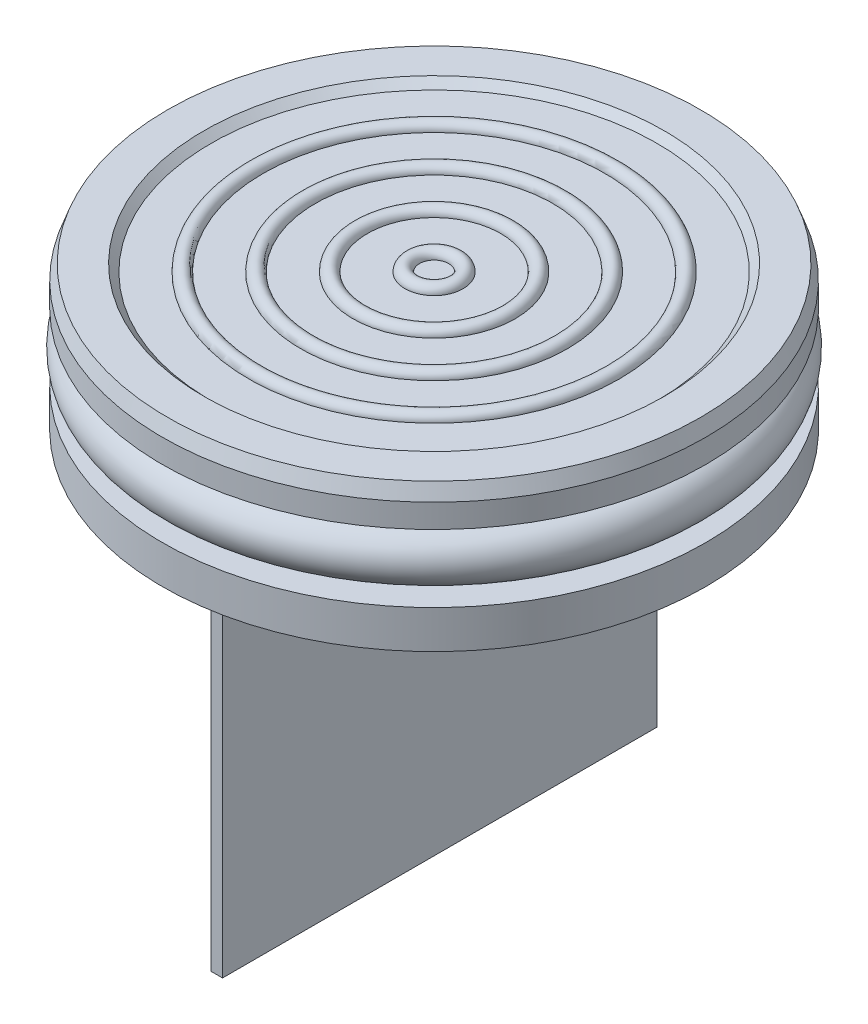
ISO-10303-21;
HEADER;
FILE_DESCRIPTION(('STEP AP214'),'2;1');
FILE_NAME('part.step','',(''),(''),'','','');
FILE_SCHEMA(('AUTOMOTIVE_DESIGN { 1 0 10303 214 1 1 1 1 }'));
ENDSEC;
DATA;
#1=APPLICATION_CONTEXT('core data for automotive mechanical design processes');
#2=APPLICATION_PROTOCOL_DEFINITION('international standard','automotive_design',2000,#1);
#3=PRODUCT_CONTEXT('',#1,'mechanical');
#4=PRODUCT('Part','Part','',(#3));
#5=PRODUCT_RELATED_PRODUCT_CATEGORY('part','',(#4));
#6=PRODUCT_DEFINITION_FORMATION('','',#4);
#7=PRODUCT_DEFINITION_CONTEXT('part definition',#1,'design');
#8=PRODUCT_DEFINITION('design','',#6,#7);
#9=PRODUCT_DEFINITION_SHAPE('','',#8);
#10=(LENGTH_UNIT() NAMED_UNIT(*) SI_UNIT(.MILLI.,.METRE.));
#11=(NAMED_UNIT(*) PLANE_ANGLE_UNIT() SI_UNIT($,.RADIAN.));
#12=(NAMED_UNIT(*) SI_UNIT($,.STERADIAN.) SOLID_ANGLE_UNIT());
#13=UNCERTAINTY_MEASURE_WITH_UNIT(LENGTH_MEASURE(1.E-05),#10,'distance_accuracy_value','');
#14=(GEOMETRIC_REPRESENTATION_CONTEXT(3) GLOBAL_UNCERTAINTY_ASSIGNED_CONTEXT((#13)) GLOBAL_UNIT_ASSIGNED_CONTEXT((#10,
#11,#12)) REPRESENTATION_CONTEXT('',''));
#15=CARTESIAN_POINT('',(0.,0.,0.));
#16=DIRECTION('',(0.,0.,1.));
#17=DIRECTION('',(1.,0.,0.));
#18=AXIS2_PLACEMENT_3D('',#15,#16,#17);
#19=CARTESIAN_POINT('',(-0.198437499999998,-15.088,7.59240723081907));
#20=DIRECTION('',(0.,0.,-1.));
#21=DIRECTION('',(-1.,0.,0.));
#22=AXIS2_PLACEMENT_3D('',#19,#20,#21);
#23=PLANE('',#22);
#24=DIRECTION('',(-1.,0.,0.));
#25=VECTOR('',#24,1.);
#26=CARTESIAN_POINT('',(-0.198437499999998,-2.388,7.59240723081907));
#27=LINE('',#26,#25);
#28=CARTESIAN_POINT('',(0.198437499999998,-2.388,7.59240723081907));
#29=VERTEX_POINT('',#28);
#30=CARTESIAN_POINT('',(-0.198437499999998,-2.388,7.59240723081907));
#31=VERTEX_POINT('',#30);
#32=EDGE_CURVE('E108',#29,#31,#27,.T.);
#33=ORIENTED_EDGE('',*,*,#32,.T.);
#34=DIRECTION('',(0.,1.,0.));
#35=VECTOR('',#34,1.);
#36=CARTESIAN_POINT('',(-0.198437499999998,-15.088,7.59240723081907));
#37=LINE('',#36,#35);
#38=CARTESIAN_POINT('',(-0.198437499999998,-15.088,7.59240723081907));
#39=VERTEX_POINT('',#38);
#40=EDGE_CURVE('E12',#39,#31,#37,.T.);
#41=ORIENTED_EDGE('',*,*,#40,.F.);
#42=DIRECTION('',(-1.,0.,0.));
#43=VECTOR('',#42,1.);
#44=CARTESIAN_POINT('',(-0.198437499999998,-15.088,7.59240723081907));
#45=LINE('',#44,#43);
#46=CARTESIAN_POINT('',(0.198437499999998,-15.088,7.59240723081907));
#47=VERTEX_POINT('',#46);
#48=EDGE_CURVE('E96',#47,#39,#45,.T.);
#49=ORIENTED_EDGE('',*,*,#48,.F.);
#50=DIRECTION('',(0.,1.,0.));
#51=VECTOR('',#50,1.);
#52=CARTESIAN_POINT('',(0.198437499999998,-15.088,7.59240723081907));
#53=LINE('',#52,#51);
#54=EDGE_CURVE('E104',#47,#29,#53,.T.);
#55=ORIENTED_EDGE('',*,*,#54,.T.);
#56=EDGE_LOOP('',(#33,#41,#49,#55));
#57=FACE_BOUND('',#56,.T.);
#58=ADVANCED_FACE('F45',(#57),#23,.F.);
#59=CARTESIAN_POINT('',(-0.198437499999998,-15.088,7.59240723081907));
#60=DIRECTION('',(1.,0.,0.));
#61=DIRECTION('',(0.,0.,-1.));
#62=AXIS2_PLACEMENT_3D('',#59,#60,#61);
#63=PLANE('',#62);
#64=DIRECTION('',(0.,0.,-1.));
#65=VECTOR('',#64,1.);
#66=CARTESIAN_POINT('',(-0.198437499999998,-2.388,7.59240723081907));
#67=LINE('',#66,#65);
#68=CARTESIAN_POINT('',(-0.198437499999998,-2.388,-7.59240723081907));
#69=VERTEX_POINT('',#68);
#70=EDGE_CURVE('E100',#31,#69,#67,.T.);
#71=ORIENTED_EDGE('',*,*,#70,.T.);
#72=DIRECTION('',(0.,1.,0.));
#73=VECTOR('',#72,1.);
#74=CARTESIAN_POINT('',(-0.198437499999998,-15.088,-7.59240723081907));
#75=LINE('',#74,#73);
#76=CARTESIAN_POINT('',(-0.198437499999998,-15.088,-7.59240723081907));
#77=VERTEX_POINT('',#76);
#78=EDGE_CURVE('E53',#77,#69,#75,.T.);
#79=ORIENTED_EDGE('',*,*,#78,.F.);
#80=DIRECTION('',(0.,0.,-1.));
#81=VECTOR('',#80,1.);
#82=CARTESIAN_POINT('',(-0.198437499999998,-15.088,7.59240723081907));
#83=LINE('',#82,#81);
#84=EDGE_CURVE('E91',#39,#77,#83,.T.);
#85=ORIENTED_EDGE('',*,*,#84,.F.);
#86=ORIENTED_EDGE('',*,*,#40,.T.);
#87=EDGE_LOOP('',(#71,#79,#85,#86));
#88=FACE_BOUND('',#87,.T.);
#89=ADVANCED_FACE('F99',(#88),#63,.F.);
#90=CARTESIAN_POINT('',(-0.198437499999998,-15.088,-7.59240723081907));
#91=DIRECTION('',(0.,0.,1.));
#92=DIRECTION('',(1.,0.,0.));
#93=AXIS2_PLACEMENT_3D('',#90,#91,#92);
#94=PLANE('',#93);
#95=DIRECTION('',(1.,0.,0.));
#96=VECTOR('',#95,1.);
#97=CARTESIAN_POINT('',(-0.198437499999998,-2.388,-7.59240723081907));
#98=LINE('',#97,#96);
#99=CARTESIAN_POINT('',(0.198437499999998,-2.388,-7.59240723081907));
#100=VERTEX_POINT('',#99);
#101=EDGE_CURVE('E78',#69,#100,#98,.T.);
#102=ORIENTED_EDGE('',*,*,#101,.T.);
#103=DIRECTION('',(0.,1.,0.));
#104=VECTOR('',#103,1.);
#105=CARTESIAN_POINT('',(0.198437499999998,-15.088,-7.59240723081907));
#106=LINE('',#105,#104);
#107=CARTESIAN_POINT('',(0.198437499999998,-15.088,-7.59240723081907));
#108=VERTEX_POINT('',#107);
#109=EDGE_CURVE('E101',#108,#100,#106,.T.);
#110=ORIENTED_EDGE('',*,*,#109,.F.);
#111=DIRECTION('',(1.,0.,0.));
#112=VECTOR('',#111,1.);
#113=CARTESIAN_POINT('',(-0.198437499999998,-15.088,-7.59240723081907));
#114=LINE('',#113,#112);
#115=EDGE_CURVE('E94',#77,#108,#114,.T.);
#116=ORIENTED_EDGE('',*,*,#115,.F.);
#117=ORIENTED_EDGE('',*,*,#78,.T.);
#118=EDGE_LOOP('',(#102,#110,#116,#117));
#119=FACE_BOUND('',#118,.T.);
#120=ADVANCED_FACE('F102',(#119),#94,.F.);
#121=CARTESIAN_POINT('',(0.198437499999998,-15.088,7.59240723081907));
#122=DIRECTION('',(-1.,0.,0.));
#123=DIRECTION('',(0.,0.,1.));
#124=AXIS2_PLACEMENT_3D('',#121,#122,#123);
#125=PLANE('',#124);
#126=DIRECTION('',(0.,0.,1.));
#127=VECTOR('',#126,1.);
#128=CARTESIAN_POINT('',(0.198437499999998,-2.388,7.59240723081907));
#129=LINE('',#128,#127);
#130=EDGE_CURVE('E84',#100,#29,#129,.T.);
#131=ORIENTED_EDGE('',*,*,#130,.T.);
#132=ORIENTED_EDGE('',*,*,#54,.F.);
#133=DIRECTION('',(0.,0.,1.));
#134=VECTOR('',#133,1.);
#135=CARTESIAN_POINT('',(0.198437499999998,-15.088,7.59240723081907));
#136=LINE('',#135,#134);
#137=EDGE_CURVE('E61',#108,#47,#136,.T.);
#138=ORIENTED_EDGE('',*,*,#137,.F.);
#139=ORIENTED_EDGE('',*,*,#109,.T.);
#140=EDGE_LOOP('',(#131,#132,#138,#139));
#141=FACE_BOUND('',#140,.T.);
#142=ADVANCED_FACE('F115',(#141),#125,.F.);
#143=CARTESIAN_POINT('',(0.,-15.088,0.));
#144=DIRECTION('',(0.,1.,0.));
#145=DIRECTION('',(0.,0.,1.));
#146=AXIS2_PLACEMENT_3D('',#143,#144,#145);
#147=PLANE('',#146);
#148=ORIENTED_EDGE('',*,*,#48,.T.);
#149=ORIENTED_EDGE('',*,*,#84,.T.);
#150=ORIENTED_EDGE('',*,*,#115,.T.);
#151=ORIENTED_EDGE('',*,*,#137,.T.);
#152=EDGE_LOOP('',(#148,#149,#150,#151));
#153=FACE_BOUND('',#152,.T.);
#154=ADVANCED_FACE('F92',(#153),#147,.F.);
#155=CARTESIAN_POINT('',(0.,-2.388,0.));
#156=DIRECTION('',(0.,1.,0.));
#157=DIRECTION('',(0.,0.,1.));
#158=AXIS2_PLACEMENT_3D('',#155,#156,#157);
#159=PLANE('',#158);
#160=ORIENTED_EDGE('',*,*,#32,.F.);
#161=ORIENTED_EDGE('',*,*,#130,.F.);
#162=ORIENTED_EDGE('',*,*,#101,.F.);
#163=ORIENTED_EDGE('',*,*,#70,.F.);
#164=EDGE_LOOP('',(#160,#161,#162,#163));
#165=FACE_BOUND('',#164,.T.);
#166=ADVANCED_FACE('F118',(#165),#159,.T.);
#167=CLOSED_SHELL('',(#58,#89,#120,#142,#154,#166));
#168=MANIFOLD_SOLID_BREP('B2',#167);
#169=CARTESIAN_POINT('',(0.,2.388,0.));
#170=DIRECTION('',(0.,-1.,0.));
#171=DIRECTION('',(1.,0.,0.));
#172=AXIS2_PLACEMENT_3D('',#169,#170,#171);
#173=PLANE('',#172);
#174=CARTESIAN_POINT('',(0.,2.388,0.));
#175=DIRECTION('',(0.,-1.,0.));
#176=DIRECTION('',(1.,0.,0.));
#177=AXIS2_PLACEMENT_3D('',#174,#175,#176);
#178=CIRCLE('',#177,0.508);
#179=CARTESIAN_POINT('',(0.508,2.388,0.));
#180=VERTEX_POINT('',#179);
#181=EDGE_CURVE('E44',#180,#180,#178,.T.);
#182=ORIENTED_EDGE('',*,*,#181,.F.);
#183=EDGE_LOOP('',(#182));
#184=FACE_BOUND('',#183,.T.);
#185=ADVANCED_FACE('F169',(#184),#173,.F.);
#186=CARTESIAN_POINT('',(0.,2.388,0.));
#187=DIRECTION('',(0.,-1.,0.));
#188=DIRECTION('',(1.,0.,0.));
#189=AXIS2_PLACEMENT_3D('',#186,#187,#188);
#190=TOROIDAL_SURFACE('',#189,0.762,0.254);
#191=CARTESIAN_POINT('',(0.,2.388,0.));
#192=DIRECTION('',(0.,-1.,0.));
#193=DIRECTION('',(1.,0.,0.));
#194=AXIS2_PLACEMENT_3D('',#191,#192,#193);
#195=CIRCLE('',#194,1.016);
#196=CARTESIAN_POINT('',(1.016,2.388,0.));
#197=VERTEX_POINT('',#196);
#198=EDGE_CURVE('E175',#197,#197,#195,.T.);
#199=ORIENTED_EDGE('',*,*,#198,.F.);
#200=EDGE_LOOP('',(#199));
#201=FACE_BOUND('',#200,.T.);
#202=ORIENTED_EDGE('',*,*,#181,.T.);
#203=EDGE_LOOP('',(#202));
#204=FACE_BOUND('',#203,.T.);
#205=ADVANCED_FACE('F388',(#201,#204),#190,.T.);
#206=CARTESIAN_POINT('',(-1.016,2.388,0.));
#207=DIRECTION('',(0.,-1.,0.));
#208=DIRECTION('',(1.,0.,0.));
#209=AXIS2_PLACEMENT_3D('',#206,#207,#208);
#210=PLANE('',#209);
#211=CARTESIAN_POINT('',(0.,2.388,0.));
#212=DIRECTION('',(0.,-1.,0.));
#213=DIRECTION('',(1.,0.,0.));
#214=AXIS2_PLACEMENT_3D('',#211,#212,#213);
#215=CIRCLE('',#214,2.32877578024819);
#216=CARTESIAN_POINT('',(2.32877578024819,2.388,0.));
#217=VERTEX_POINT('',#216);
#218=EDGE_CURVE('E179',#217,#217,#215,.T.);
#219=ORIENTED_EDGE('',*,*,#218,.F.);
#220=EDGE_LOOP('',(#219));
#221=FACE_BOUND('',#220,.T.);
#222=ORIENTED_EDGE('',*,*,#198,.T.);
#223=EDGE_LOOP('',(#222));
#224=FACE_BOUND('',#223,.T.);
#225=ADVANCED_FACE('F383',(#221,#224),#210,.F.);
#226=CARTESIAN_POINT('',(0.,2.388,0.));
#227=DIRECTION('',(0.,-1.,0.));
#228=DIRECTION('',(1.,0.,0.));
#229=AXIS2_PLACEMENT_3D('',#226,#227,#228);
#230=TOROIDAL_SURFACE('',#229,2.58277578024819,0.254);
#231=CARTESIAN_POINT('',(0.,2.388,0.));
#232=DIRECTION('',(0.,-1.,0.));
#233=DIRECTION('',(1.,0.,0.));
#234=AXIS2_PLACEMENT_3D('',#231,#232,#233);
#235=CIRCLE('',#234,2.83677578024819);
#236=CARTESIAN_POINT('',(2.83677578024819,2.388,0.));
#237=VERTEX_POINT('',#236);
#238=EDGE_CURVE('E183',#237,#237,#235,.T.);
#239=ORIENTED_EDGE('',*,*,#238,.F.);
#240=EDGE_LOOP('',(#239));
#241=FACE_BOUND('',#240,.T.);
#242=ORIENTED_EDGE('',*,*,#218,.T.);
#243=EDGE_LOOP('',(#242));
#244=FACE_BOUND('',#243,.T.);
#245=ADVANCED_FACE('F377',(#241,#244),#230,.T.);
#246=CARTESIAN_POINT('',(-2.83677578024819,2.388,0.));
#247=DIRECTION('',(0.,-1.,0.));
#248=DIRECTION('',(1.,0.,0.));
#249=AXIS2_PLACEMENT_3D('',#246,#247,#248);
#250=PLANE('',#249);
#251=CARTESIAN_POINT('',(0.,2.388,0.));
#252=DIRECTION('',(0.,-1.,0.));
#253=DIRECTION('',(1.,0.,0.));
#254=AXIS2_PLACEMENT_3D('',#251,#252,#253);
#255=CIRCLE('',#254,4.14955156049639);
#256=CARTESIAN_POINT('',(4.14955156049639,2.388,0.));
#257=VERTEX_POINT('',#256);
#258=EDGE_CURVE('E188',#257,#257,#255,.T.);
#259=ORIENTED_EDGE('',*,*,#258,.F.);
#260=EDGE_LOOP('',(#259));
#261=FACE_BOUND('',#260,.T.);
#262=ORIENTED_EDGE('',*,*,#238,.T.);
#263=EDGE_LOOP('',(#262));
#264=FACE_BOUND('',#263,.T.);
#265=ADVANCED_FACE('F371',(#261,#264),#250,.F.);
#266=CARTESIAN_POINT('',(0.,2.388,0.));
#267=DIRECTION('',(0.,-1.,0.));
#268=DIRECTION('',(1.,0.,0.));
#269=AXIS2_PLACEMENT_3D('',#266,#267,#268);
#270=TOROIDAL_SURFACE('',#269,4.40355156049639,0.254);
#271=CARTESIAN_POINT('',(0.,2.388,0.));
#272=DIRECTION('',(0.,-1.,0.));
#273=DIRECTION('',(1.,0.,0.));
#274=AXIS2_PLACEMENT_3D('',#271,#272,#273);
#275=CIRCLE('',#274,4.65755156049639);
#276=CARTESIAN_POINT('',(4.65755156049639,2.388,0.));
#277=VERTEX_POINT('',#276);
#278=EDGE_CURVE('E191',#277,#277,#275,.T.);
#279=ORIENTED_EDGE('',*,*,#278,.F.);
#280=EDGE_LOOP('',(#279));
#281=FACE_BOUND('',#280,.T.);
#282=ORIENTED_EDGE('',*,*,#258,.T.);
#283=EDGE_LOOP('',(#282));
#284=FACE_BOUND('',#283,.T.);
#285=ADVANCED_FACE('F365',(#281,#284),#270,.T.);
#286=CARTESIAN_POINT('',(-4.65755156049639,2.388,0.));
#287=DIRECTION('',(0.,-1.,0.));
#288=DIRECTION('',(1.,0.,0.));
#289=AXIS2_PLACEMENT_3D('',#286,#287,#288);
#290=PLANE('',#289);
#291=CARTESIAN_POINT('',(0.,2.388,0.));
#292=DIRECTION('',(0.,-1.,0.));
#293=DIRECTION('',(1.,0.,0.));
#294=AXIS2_PLACEMENT_3D('',#291,#292,#293);
#295=CIRCLE('',#294,5.97032734074458);
#296=CARTESIAN_POINT('',(5.97032734074458,2.388,0.));
#297=VERTEX_POINT('',#296);
#298=EDGE_CURVE('E194',#297,#297,#295,.T.);
#299=ORIENTED_EDGE('',*,*,#298,.F.);
#300=EDGE_LOOP('',(#299));
#301=FACE_BOUND('',#300,.T.);
#302=ORIENTED_EDGE('',*,*,#278,.T.);
#303=EDGE_LOOP('',(#302));
#304=FACE_BOUND('',#303,.T.);
#305=ADVANCED_FACE('F359',(#301,#304),#290,.F.);
#306=CARTESIAN_POINT('',(0.,2.388,0.));
#307=DIRECTION('',(0.,-1.,0.));
#308=DIRECTION('',(1.,0.,0.));
#309=AXIS2_PLACEMENT_3D('',#306,#307,#308);
#310=TOROIDAL_SURFACE('',#309,6.22432734074458,0.254);
#311=CARTESIAN_POINT('',(0.,2.388,0.));
#312=DIRECTION('',(0.,-1.,0.));
#313=DIRECTION('',(1.,0.,0.));
#314=AXIS2_PLACEMENT_3D('',#311,#312,#313);
#315=CIRCLE('',#314,6.47832734074458);
#316=CARTESIAN_POINT('',(6.47832734074458,2.388,0.));
#317=VERTEX_POINT('',#316);
#318=EDGE_CURVE('E197',#317,#317,#315,.T.);
#319=ORIENTED_EDGE('',*,*,#318,.F.);
#320=EDGE_LOOP('',(#319));
#321=FACE_BOUND('',#320,.T.);
#322=ORIENTED_EDGE('',*,*,#298,.T.);
#323=EDGE_LOOP('',(#322));
#324=FACE_BOUND('',#323,.T.);
#325=ADVANCED_FACE('F353',(#321,#324),#310,.T.);
#326=CARTESIAN_POINT('',(-6.47832734074458,2.388,0.));
#327=DIRECTION('',(0.,-1.,0.));
#328=DIRECTION('',(1.,0.,0.));
#329=AXIS2_PLACEMENT_3D('',#326,#327,#328);
#330=PLANE('',#329);
#331=CARTESIAN_POINT('',(0.,2.388,0.));
#332=DIRECTION('',(0.,-1.,0.));
#333=DIRECTION('',(1.,0.,0.));
#334=AXIS2_PLACEMENT_3D('',#331,#332,#333);
#335=CIRCLE('',#334,7.79110312099277);
#336=CARTESIAN_POINT('',(7.79110312099277,2.388,0.));
#337=VERTEX_POINT('',#336);
#338=EDGE_CURVE('E200',#337,#337,#335,.T.);
#339=ORIENTED_EDGE('',*,*,#338,.F.);
#340=EDGE_LOOP('',(#339));
#341=FACE_BOUND('',#340,.T.);
#342=ORIENTED_EDGE('',*,*,#318,.T.);
#343=EDGE_LOOP('',(#342));
#344=FACE_BOUND('',#343,.T.);
#345=ADVANCED_FACE('F347',(#341,#344),#330,.F.);
#346=CARTESIAN_POINT('',(0.,2.388,0.));
#347=DIRECTION('',(0.,1.,0.));
#348=DIRECTION('',(-1.,0.,0.));
#349=AXIS2_PLACEMENT_3D('',#346,#347,#348);
#350=CONICAL_SURFACE('',#349,7.79110312099277,0.785398163397448);
#351=CARTESIAN_POINT('',(0.,2.642,0.));
#352=DIRECTION('',(0.,-1.,0.));
#353=DIRECTION('',(1.,0.,0.));
#354=AXIS2_PLACEMENT_3D('',#351,#352,#353);
#355=CIRCLE('',#354,8.04510312099277);
#356=CARTESIAN_POINT('',(8.04510312099277,2.642,0.));
#357=VERTEX_POINT('',#356);
#358=EDGE_CURVE('E203',#357,#357,#355,.T.);
#359=ORIENTED_EDGE('',*,*,#358,.F.);
#360=EDGE_LOOP('',(#359));
#361=FACE_BOUND('',#360,.T.);
#362=ORIENTED_EDGE('',*,*,#338,.T.);
#363=EDGE_LOOP('',(#362));
#364=FACE_BOUND('',#363,.T.);
#365=ADVANCED_FACE('F341',(#361,#364),#350,.F.);
#366=CARTESIAN_POINT('',(-8.04510312099277,2.642,0.));
#367=DIRECTION('',(0.,-1.,0.));
#368=DIRECTION('',(1.,0.,0.));
#369=AXIS2_PLACEMENT_3D('',#366,#367,#368);
#370=PLANE('',#369);
#371=CARTESIAN_POINT('',(0.,2.642,0.));
#372=DIRECTION('',(0.,-1.,0.));
#373=DIRECTION('',(1.,0.,0.));
#374=AXIS2_PLACEMENT_3D('',#371,#372,#373);
#375=CIRCLE('',#374,9.31510312099277);
#376=CARTESIAN_POINT('',(9.31510312099277,2.642,0.));
#377=VERTEX_POINT('',#376);
#378=EDGE_CURVE('E206',#377,#377,#375,.T.);
#379=ORIENTED_EDGE('',*,*,#378,.F.);
#380=EDGE_LOOP('',(#379));
#381=FACE_BOUND('',#380,.T.);
#382=ORIENTED_EDGE('',*,*,#358,.T.);
#383=EDGE_LOOP('',(#382));
#384=FACE_BOUND('',#383,.T.);
#385=ADVANCED_FACE('F335',(#381,#384),#370,.F.);
#386=CARTESIAN_POINT('',(0.,2.642,0.));
#387=DIRECTION('',(0.,-1.,0.));
#388=DIRECTION('',(1.,0.,0.));
#389=AXIS2_PLACEMENT_3D('',#386,#387,#388);
#390=CONICAL_SURFACE('',#389,9.31510312099277,0.349065850398862);
#391=CARTESIAN_POINT('',(0.,2.134,0.));
#392=DIRECTION('',(0.,-1.,0.));
#393=DIRECTION('',(1.,0.,0.));
#394=AXIS2_PLACEMENT_3D('',#391,#392,#393);
#395=CIRCLE('',#394,9.5);
#396=CARTESIAN_POINT('',(9.5,2.134,0.));
#397=VERTEX_POINT('',#396);
#398=EDGE_CURVE('E209',#397,#397,#395,.T.);
#399=ORIENTED_EDGE('',*,*,#398,.F.);
#400=EDGE_LOOP('',(#399));
#401=FACE_BOUND('',#400,.T.);
#402=ORIENTED_EDGE('',*,*,#378,.T.);
#403=EDGE_LOOP('',(#402));
#404=FACE_BOUND('',#403,.T.);
#405=ADVANCED_FACE('F329',(#401,#404),#390,.T.);
#406=CARTESIAN_POINT('',(0.,-2.388,0.));
#407=DIRECTION('',(0.,-1.,0.));
#408=DIRECTION('',(1.,0.,0.));
#409=AXIS2_PLACEMENT_3D('',#406,#407,#408);
#410=CYLINDRICAL_SURFACE('',#409,9.5);
#411=CARTESIAN_POINT('',(0.,1.3081,0.));
#412=DIRECTION('',(0.,-1.,0.));
#413=DIRECTION('',(1.,0.,0.));
#414=AXIS2_PLACEMENT_3D('',#411,#412,#413);
#415=CIRCLE('',#414,9.5);
#416=CARTESIAN_POINT('',(9.5,1.3081,0.));
#417=VERTEX_POINT('',#416);
#418=EDGE_CURVE('E212',#417,#417,#415,.T.);
#419=ORIENTED_EDGE('',*,*,#418,.F.);
#420=EDGE_LOOP('',(#419));
#421=FACE_BOUND('',#420,.T.);
#422=ORIENTED_EDGE('',*,*,#398,.T.);
#423=EDGE_LOOP('',(#422));
#424=FACE_BOUND('',#423,.T.);
#425=ADVANCED_FACE('F323',(#421,#424),#410,.T.);
#426=CARTESIAN_POINT('',(-9.5,1.3081,0.));
#427=DIRECTION('',(0.,1.,0.));
#428=DIRECTION('',(-1.,0.,0.));
#429=AXIS2_PLACEMENT_3D('',#426,#427,#428);
#430=PLANE('',#429);
#431=CARTESIAN_POINT('',(0.,1.3081,0.));
#432=DIRECTION('',(0.,-1.,0.));
#433=DIRECTION('',(1.,0.,0.));
#434=AXIS2_PLACEMENT_3D('',#431,#432,#433);
#435=CIRCLE('',#434,8.23);
#436=CARTESIAN_POINT('',(8.23,1.3081,0.));
#437=VERTEX_POINT('',#436);
#438=EDGE_CURVE('E215',#437,#437,#435,.T.);
#439=ORIENTED_EDGE('',*,*,#438,.F.);
#440=EDGE_LOOP('',(#439));
#441=FACE_BOUND('',#440,.T.);
#442=ORIENTED_EDGE('',*,*,#418,.T.);
#443=EDGE_LOOP('',(#442));
#444=FACE_BOUND('',#443,.T.);
#445=ADVANCED_FACE('F317',(#441,#444),#430,.F.);
#446=CARTESIAN_POINT('',(0.,-2.388,0.));
#447=DIRECTION('',(0.,-1.,0.));
#448=DIRECTION('',(1.,0.,0.));
#449=AXIS2_PLACEMENT_3D('',#446,#447,#448);
#450=CYLINDRICAL_SURFACE('',#449,8.23);
#451=CARTESIAN_POINT('',(0.,0.890828357682536,0.));
#452=DIRECTION('',(0.,-1.,0.));
#453=DIRECTION('',(1.,0.,0.));
#454=AXIS2_PLACEMENT_3D('',#451,#452,#453);
#455=CIRCLE('',#454,8.23);
#456=CARTESIAN_POINT('',(8.23,0.890828357682536,0.));
#457=VERTEX_POINT('',#456);
#458=EDGE_CURVE('E218',#457,#457,#455,.T.);
#459=ORIENTED_EDGE('',*,*,#458,.F.);
#460=EDGE_LOOP('',(#459));
#461=FACE_BOUND('',#460,.T.);
#462=ORIENTED_EDGE('',*,*,#438,.T.);
#463=EDGE_LOOP('',(#462));
#464=FACE_BOUND('',#463,.T.);
#465=ADVANCED_FACE('F311',(#461,#464),#450,.T.);
#466=CARTESIAN_POINT('',(0.,0.127,0.));
#467=DIRECTION('',(0.,-1.,0.));
#468=DIRECTION('',(1.,0.,0.));
#469=AXIS2_PLACEMENT_3D('',#466,#467,#468);
#470=TOROIDAL_SURFACE('',#469,8.6868,0.89);
#471=CARTESIAN_POINT('',(0.,-0.636828357682536,0.));
#472=DIRECTION('',(0.,-1.,0.));
#473=DIRECTION('',(1.,0.,0.));
#474=AXIS2_PLACEMENT_3D('',#471,#472,#473);
#475=CIRCLE('',#474,8.23);
#476=CARTESIAN_POINT('',(8.23,-0.636828357682536,0.));
#477=VERTEX_POINT('',#476);
#478=EDGE_CURVE('E221',#477,#477,#475,.T.);
#479=ORIENTED_EDGE('',*,*,#478,.F.);
#480=EDGE_LOOP('',(#479));
#481=FACE_BOUND('',#480,.T.);
#482=ORIENTED_EDGE('',*,*,#458,.T.);
#483=EDGE_LOOP('',(#482));
#484=FACE_BOUND('',#483,.T.);
#485=ADVANCED_FACE('F305',(#481,#484),#470,.T.);
#486=CARTESIAN_POINT('',(0.,-2.388,0.));
#487=DIRECTION('',(0.,-1.,0.));
#488=DIRECTION('',(1.,0.,0.));
#489=AXIS2_PLACEMENT_3D('',#486,#487,#488);
#490=CYLINDRICAL_SURFACE('',#489,8.23);
#491=CARTESIAN_POINT('',(0.,-1.0541,0.));
#492=DIRECTION('',(0.,-1.,0.));
#493=DIRECTION('',(1.,0.,0.));
#494=AXIS2_PLACEMENT_3D('',#491,#492,#493);
#495=CIRCLE('',#494,8.23);
#496=CARTESIAN_POINT('',(8.23,-1.0541,0.));
#497=VERTEX_POINT('',#496);
#498=EDGE_CURVE('E224',#497,#497,#495,.T.);
#499=ORIENTED_EDGE('',*,*,#498,.F.);
#500=EDGE_LOOP('',(#499));
#501=FACE_BOUND('',#500,.T.);
#502=ORIENTED_EDGE('',*,*,#478,.T.);
#503=EDGE_LOOP('',(#502));
#504=FACE_BOUND('',#503,.T.);
#505=ADVANCED_FACE('F299',(#501,#504),#490,.T.);
#506=CARTESIAN_POINT('',(-8.23,-1.0541,0.));
#507=DIRECTION('',(0.,-1.,0.));
#508=DIRECTION('',(1.,0.,0.));
#509=AXIS2_PLACEMENT_3D('',#506,#507,#508);
#510=PLANE('',#509);
#511=CARTESIAN_POINT('',(0.,-1.0541,0.));
#512=DIRECTION('',(0.,-1.,0.));
#513=DIRECTION('',(1.,0.,0.));
#514=AXIS2_PLACEMENT_3D('',#511,#512,#513);
#515=CIRCLE('',#514,9.5);
#516=CARTESIAN_POINT('',(9.5,-1.0541,0.));
#517=VERTEX_POINT('',#516);
#518=EDGE_CURVE('E227',#517,#517,#515,.T.);
#519=ORIENTED_EDGE('',*,*,#518,.F.);
#520=EDGE_LOOP('',(#519));
#521=FACE_BOUND('',#520,.T.);
#522=ORIENTED_EDGE('',*,*,#498,.T.);
#523=EDGE_LOOP('',(#522));
#524=FACE_BOUND('',#523,.T.);
#525=ADVANCED_FACE('F293',(#521,#524),#510,.F.);
#526=CARTESIAN_POINT('',(0.,-2.388,0.));
#527=DIRECTION('',(0.,-1.,0.));
#528=DIRECTION('',(1.,0.,0.));
#529=AXIS2_PLACEMENT_3D('',#526,#527,#528);
#530=CYLINDRICAL_SURFACE('',#529,9.5);
#531=CARTESIAN_POINT('',(0.,-2.388,0.));
#532=DIRECTION('',(0.,-1.,0.));
#533=DIRECTION('',(1.,0.,0.));
#534=AXIS2_PLACEMENT_3D('',#531,#532,#533);
#535=CIRCLE('',#534,9.5);
#536=CARTESIAN_POINT('',(9.5,-2.388,0.));
#537=VERTEX_POINT('',#536);
#538=EDGE_CURVE('E230',#537,#537,#535,.T.);
#539=ORIENTED_EDGE('',*,*,#538,.F.);
#540=EDGE_LOOP('',(#539));
#541=FACE_BOUND('',#540,.T.);
#542=ORIENTED_EDGE('',*,*,#518,.T.);
#543=EDGE_LOOP('',(#542));
#544=FACE_BOUND('',#543,.T.);
#545=ADVANCED_FACE('F287',(#541,#544),#530,.T.);
#546=CARTESIAN_POINT('',(-9.5,-2.388,0.));
#547=DIRECTION('',(0.,1.,0.));
#548=DIRECTION('',(-1.,0.,0.));
#549=AXIS2_PLACEMENT_3D('',#546,#547,#548);
#550=PLANE('',#549);
#551=CARTESIAN_POINT('',(0.,-2.388,0.));
#552=DIRECTION('',(0.,-1.,0.));
#553=DIRECTION('',(1.,0.,0.));
#554=AXIS2_PLACEMENT_3D('',#551,#552,#553);
#555=CIRCLE('',#554,7.976);
#556=CARTESIAN_POINT('',(7.976,-2.388,0.));
#557=VERTEX_POINT('',#556);
#558=EDGE_CURVE('E233',#557,#557,#555,.T.);
#559=ORIENTED_EDGE('',*,*,#558,.F.);
#560=EDGE_LOOP('',(#559));
#561=FACE_BOUND('',#560,.T.);
#562=ORIENTED_EDGE('',*,*,#538,.T.);
#563=EDGE_LOOP('',(#562));
#564=FACE_BOUND('',#563,.T.);
#565=ADVANCED_FACE('F281',(#561,#564),#550,.F.);
#566=CARTESIAN_POINT('',(0.,-2.388,0.));
#567=DIRECTION('',(0.,-1.,0.));
#568=DIRECTION('',(1.,0.,0.));
#569=AXIS2_PLACEMENT_3D('',#566,#567,#568);
#570=CYLINDRICAL_SURFACE('',#569,7.976);
#571=CARTESIAN_POINT('',(0.,-1.3081,0.));
#572=DIRECTION('',(0.,-1.,0.));
#573=DIRECTION('',(1.,0.,0.));
#574=AXIS2_PLACEMENT_3D('',#571,#572,#573);
#575=CIRCLE('',#574,7.976);
#576=CARTESIAN_POINT('',(7.976,-1.3081,0.));
#577=VERTEX_POINT('',#576);
#578=EDGE_CURVE('E236',#577,#577,#575,.T.);
#579=ORIENTED_EDGE('',*,*,#578,.F.);
#580=EDGE_LOOP('',(#579));
#581=FACE_BOUND('',#580,.T.);
#582=ORIENTED_EDGE('',*,*,#558,.T.);
#583=EDGE_LOOP('',(#582));
#584=FACE_BOUND('',#583,.T.);
#585=ADVANCED_FACE('F275',(#581,#584),#570,.F.);
#586=CARTESIAN_POINT('',(-7.976,-1.3081,0.));
#587=DIRECTION('',(0.,1.,0.));
#588=DIRECTION('',(-1.,0.,0.));
#589=AXIS2_PLACEMENT_3D('',#586,#587,#588);
#590=PLANE('',#589);
#591=CARTESIAN_POINT('',(0.,-1.3081,0.));
#592=DIRECTION('',(0.,-1.,0.));
#593=DIRECTION('',(1.,0.,0.));
#594=AXIS2_PLACEMENT_3D('',#591,#592,#593);
#595=CIRCLE('',#594,7.722);
#596=CARTESIAN_POINT('',(7.722,-1.3081,0.));
#597=VERTEX_POINT('',#596);
#598=EDGE_CURVE('E239',#597,#597,#595,.T.);
#599=ORIENTED_EDGE('',*,*,#598,.F.);
#600=EDGE_LOOP('',(#599));
#601=FACE_BOUND('',#600,.T.);
#602=ORIENTED_EDGE('',*,*,#578,.T.);
#603=EDGE_LOOP('',(#602));
#604=FACE_BOUND('',#603,.T.);
#605=ADVANCED_FACE('F269',(#601,#604),#590,.F.);
#606=CARTESIAN_POINT('',(0.,-2.388,0.));
#607=DIRECTION('',(0.,-1.,0.));
#608=DIRECTION('',(1.,0.,0.));
#609=AXIS2_PLACEMENT_3D('',#606,#607,#608);
#610=CYLINDRICAL_SURFACE('',#609,7.722);
#611=CARTESIAN_POINT('',(0.,-2.007,0.));
#612=DIRECTION('',(0.,-1.,0.));
#613=DIRECTION('',(1.,0.,0.));
#614=AXIS2_PLACEMENT_3D('',#611,#612,#613);
#615=CIRCLE('',#614,7.722);
#616=CARTESIAN_POINT('',(7.722,-2.007,0.));
#617=VERTEX_POINT('',#616);
#618=EDGE_CURVE('E242',#617,#617,#615,.T.);
#619=ORIENTED_EDGE('',*,*,#618,.F.);
#620=EDGE_LOOP('',(#619));
#621=FACE_BOUND('',#620,.T.);
#622=ORIENTED_EDGE('',*,*,#598,.T.);
#623=EDGE_LOOP('',(#622));
#624=FACE_BOUND('',#623,.T.);
#625=ADVANCED_FACE('F263',(#621,#624),#610,.T.);
#626=CARTESIAN_POINT('',(-7.722,-2.007,0.));
#627=DIRECTION('',(0.,1.,0.));
#628=DIRECTION('',(-1.,0.,0.));
#629=AXIS2_PLACEMENT_3D('',#626,#627,#628);
#630=PLANE('',#629);
#631=CARTESIAN_POINT('',(0.,-2.007,0.));
#632=DIRECTION('',(0.,-1.,0.));
#633=DIRECTION('',(1.,0.,0.));
#634=AXIS2_PLACEMENT_3D('',#631,#632,#633);
#635=CIRCLE('',#634,7.595);
#636=CARTESIAN_POINT('',(7.595,-2.007,0.));
#637=VERTEX_POINT('',#636);
#638=EDGE_CURVE('E245',#637,#637,#635,.T.);
#639=ORIENTED_EDGE('',*,*,#638,.F.);
#640=EDGE_LOOP('',(#639));
#641=FACE_BOUND('',#640,.T.);
#642=ORIENTED_EDGE('',*,*,#618,.T.);
#643=EDGE_LOOP('',(#642));
#644=FACE_BOUND('',#643,.T.);
#645=ADVANCED_FACE('F257',(#641,#644),#630,.F.);
#646=CARTESIAN_POINT('',(0.,-2.388,0.));
#647=DIRECTION('',(0.,-1.,0.));
#648=DIRECTION('',(1.,0.,0.));
#649=AXIS2_PLACEMENT_3D('',#646,#647,#648);
#650=CYLINDRICAL_SURFACE('',#649,7.595);
#651=CARTESIAN_POINT('',(0.,-2.388,0.));
#652=DIRECTION('',(0.,-1.,0.));
#653=DIRECTION('',(1.,0.,0.));
#654=AXIS2_PLACEMENT_3D('',#651,#652,#653);
#655=CIRCLE('',#654,7.595);
#656=CARTESIAN_POINT('',(7.595,-2.388,0.));
#657=VERTEX_POINT('',#656);
#658=EDGE_CURVE('E248',#657,#657,#655,.T.);
#659=ORIENTED_EDGE('',*,*,#658,.F.);
#660=EDGE_LOOP('',(#659));
#661=FACE_BOUND('',#660,.T.);
#662=ORIENTED_EDGE('',*,*,#638,.T.);
#663=EDGE_LOOP('',(#662));
#664=FACE_BOUND('',#663,.T.);
#665=ADVANCED_FACE('F254',(#661,#664),#650,.T.);
#666=CARTESIAN_POINT('',(-7.595,-2.388,0.));
#667=DIRECTION('',(0.,1.,0.));
#668=DIRECTION('',(-1.,0.,0.));
#669=AXIS2_PLACEMENT_3D('',#666,#667,#668);
#670=PLANE('',#669);
#671=ORIENTED_EDGE('',*,*,#658,.T.);
#672=EDGE_LOOP('',(#671));
#673=FACE_BOUND('',#672,.T.);
#674=ADVANCED_FACE('F252',(#673),#670,.F.);
#675=CLOSED_SHELL('',(#185,#205,#225,#245,#265,#285,#305,#325,#345,#365,#385,#405,#425,#445,
#465,#485,#505,#525,#545,#565,#585,#605,#625,#645,#665,#674));
#676=MANIFOLD_SOLID_BREP('B6',#675);
#677=ADVANCED_BREP_SHAPE_REPRESENTATION('',(#18,#168,#676),#14);
#678=SHAPE_DEFINITION_REPRESENTATION(#9,#677);
ENDSEC;
END-ISO-10303-21;
